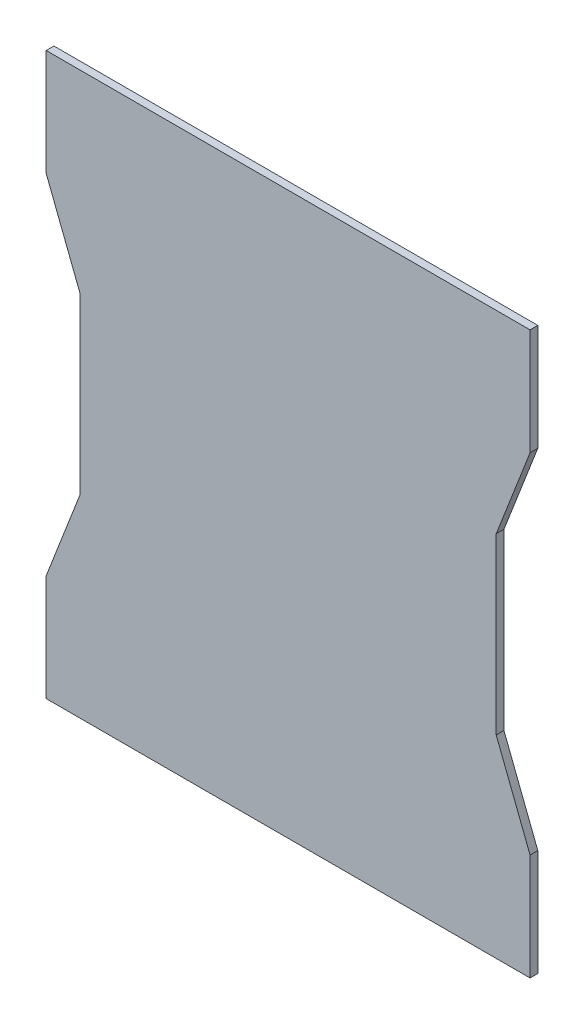
ISO-10303-21;
HEADER;
FILE_DESCRIPTION(('STEP AP214'),'2;1');
FILE_NAME('part.step','',(''),(''),'','','');
FILE_SCHEMA(('AUTOMOTIVE_DESIGN { 1 0 10303 214 1 1 1 1 }'));
ENDSEC;
DATA;
#1=APPLICATION_CONTEXT('core data for automotive mechanical design processes');
#2=APPLICATION_PROTOCOL_DEFINITION('international standard','automotive_design',2000,#1);
#3=PRODUCT_CONTEXT('',#1,'mechanical');
#4=PRODUCT('Part','Part','',(#3));
#5=PRODUCT_RELATED_PRODUCT_CATEGORY('part','',(#4));
#6=PRODUCT_DEFINITION_FORMATION('','',#4);
#7=PRODUCT_DEFINITION_CONTEXT('part definition',#1,'design');
#8=PRODUCT_DEFINITION('design','',#6,#7);
#9=PRODUCT_DEFINITION_SHAPE('','',#8);
#10=(LENGTH_UNIT() NAMED_UNIT(*) SI_UNIT(.MILLI.,.METRE.));
#11=(NAMED_UNIT(*) PLANE_ANGLE_UNIT() SI_UNIT($,.RADIAN.));
#12=(NAMED_UNIT(*) SI_UNIT($,.STERADIAN.) SOLID_ANGLE_UNIT());
#13=UNCERTAINTY_MEASURE_WITH_UNIT(LENGTH_MEASURE(1.E-05),#10,'distance_accuracy_value','');
#14=(GEOMETRIC_REPRESENTATION_CONTEXT(3) GLOBAL_UNCERTAINTY_ASSIGNED_CONTEXT((#13)) GLOBAL_UNIT_ASSIGNED_CONTEXT((#10,
#11,#12)) REPRESENTATION_CONTEXT('',''));
#15=CARTESIAN_POINT('',(0.,0.,0.));
#16=DIRECTION('',(0.,0.,1.));
#17=DIRECTION('',(1.,0.,0.));
#18=AXIS2_PLACEMENT_3D('',#15,#16,#17);
#19=CARTESIAN_POINT('',(-500.,580.,16.));
#20=DIRECTION('',(1.,0.,0.));
#21=DIRECTION('',(0.,1.,0.));
#22=AXIS2_PLACEMENT_3D('',#19,#20,#21);
#23=PLANE('',#22);
#24=DIRECTION('',(0.,-1.,0.));
#25=VECTOR('',#24,1.);
#26=CARTESIAN_POINT('',(-500.,580.,0.));
#27=LINE('',#26,#25);
#28=CARTESIAN_POINT('',(-500.,580.,0.));
#29=VERTEX_POINT('',#28);
#30=CARTESIAN_POINT('',(-500.,360.,0.));
#31=VERTEX_POINT('',#30);
#32=EDGE_CURVE('E192',#29,#31,#27,.T.);
#33=ORIENTED_EDGE('',*,*,#32,.T.);
#34=DIRECTION('',(0.,0.,-1.));
#35=VECTOR('',#34,1.);
#36=CARTESIAN_POINT('',(-500.,360.,16.));
#37=LINE('',#36,#35);
#38=CARTESIAN_POINT('',(-500.,360.,16.));
#39=VERTEX_POINT('',#38);
#40=EDGE_CURVE('E150',#39,#31,#37,.T.);
#41=ORIENTED_EDGE('',*,*,#40,.F.);
#42=DIRECTION('',(0.,-1.,0.));
#43=VECTOR('',#42,1.);
#44=CARTESIAN_POINT('',(-500.,580.,16.));
#45=LINE('',#44,#43);
#46=CARTESIAN_POINT('',(-500.,580.,16.));
#47=VERTEX_POINT('',#46);
#48=EDGE_CURVE('E141',#47,#39,#45,.T.);
#49=ORIENTED_EDGE('',*,*,#48,.F.);
#50=DIRECTION('',(0.,0.,-1.));
#51=VECTOR('',#50,1.);
#52=CARTESIAN_POINT('',(-500.,580.,16.));
#53=LINE('',#52,#51);
#54=EDGE_CURVE('E191',#47,#29,#53,.T.);
#55=ORIENTED_EDGE('',*,*,#54,.T.);
#56=EDGE_LOOP('',(#33,#41,#49,#55));
#57=FACE_BOUND('',#56,.T.);
#58=ADVANCED_FACE('F32',(#57),#23,.F.);
#59=CARTESIAN_POINT('',(500.,580.,16.));
#60=DIRECTION('',(-1.,0.,0.));
#61=DIRECTION('',(0.,-1.,0.));
#62=AXIS2_PLACEMENT_3D('',#59,#60,#61);
#63=PLANE('',#62);
#64=DIRECTION('',(0.,1.,0.));
#65=VECTOR('',#64,1.);
#66=CARTESIAN_POINT('',(500.,580.,16.));
#67=LINE('',#66,#65);
#68=CARTESIAN_POINT('',(500.,360.,16.));
#69=VERTEX_POINT('',#68);
#70=CARTESIAN_POINT('',(500.,580.,16.));
#71=VERTEX_POINT('',#70);
#72=EDGE_CURVE('E185',#69,#71,#67,.T.);
#73=ORIENTED_EDGE('',*,*,#72,.F.);
#74=DIRECTION('',(0.,0.,-1.));
#75=VECTOR('',#74,1.);
#76=CARTESIAN_POINT('',(500.,360.,16.));
#77=LINE('',#76,#75);
#78=CARTESIAN_POINT('',(500.,360.,0.));
#79=VERTEX_POINT('',#78);
#80=EDGE_CURVE('E172',#69,#79,#77,.T.);
#81=ORIENTED_EDGE('',*,*,#80,.T.);
#82=DIRECTION('',(0.,1.,0.));
#83=VECTOR('',#82,1.);
#84=CARTESIAN_POINT('',(500.,580.,0.));
#85=LINE('',#84,#83);
#86=CARTESIAN_POINT('',(500.,580.,0.));
#87=VERTEX_POINT('',#86);
#88=EDGE_CURVE('E197',#79,#87,#85,.T.);
#89=ORIENTED_EDGE('',*,*,#88,.T.);
#90=DIRECTION('',(0.,0.,-1.));
#91=VECTOR('',#90,1.);
#92=CARTESIAN_POINT('',(500.,580.,16.));
#93=LINE('',#92,#91);
#94=EDGE_CURVE('E205',#71,#87,#93,.T.);
#95=ORIENTED_EDGE('',*,*,#94,.F.);
#96=EDGE_LOOP('',(#73,#81,#89,#95));
#97=FACE_BOUND('',#96,.T.);
#98=ADVANCED_FACE('F242',(#97),#63,.F.);
#99=CARTESIAN_POINT('',(-500.,-360.,16.));
#100=VERTEX_POINT('',#99);
#101=CARTESIAN_POINT('',(-500.,-580.,16.));
#102=VERTEX_POINT('',#101);
#103=EDGE_CURVE('E183',#100,#102,#45,.T.);
#104=ORIENTED_EDGE('',*,*,#103,.F.);
#105=DIRECTION('',(0.,0.,-1.));
#106=VECTOR('',#105,1.);
#107=CARTESIAN_POINT('',(-500.,-360.,16.));
#108=LINE('',#107,#106);
#109=CARTESIAN_POINT('',(-500.,-360.,0.));
#110=VERTEX_POINT('',#109);
#111=EDGE_CURVE('E153',#100,#110,#108,.T.);
#112=ORIENTED_EDGE('',*,*,#111,.T.);
#113=CARTESIAN_POINT('',(-500.,-580.,0.));
#114=VERTEX_POINT('',#113);
#115=EDGE_CURVE('E175',#110,#114,#27,.T.);
#116=ORIENTED_EDGE('',*,*,#115,.T.);
#117=DIRECTION('',(0.,0.,-1.));
#118=VECTOR('',#117,1.);
#119=CARTESIAN_POINT('',(-500.,-580.,16.));
#120=LINE('',#119,#118);
#121=EDGE_CURVE('E11',#102,#114,#120,.T.);
#122=ORIENTED_EDGE('',*,*,#121,.F.);
#123=EDGE_LOOP('',(#104,#112,#116,#122));
#124=FACE_BOUND('',#123,.T.);
#125=ADVANCED_FACE('F34',(#124),#23,.F.);
#126=CARTESIAN_POINT('',(-500.,-580.,16.));
#127=DIRECTION('',(0.,1.,0.));
#128=DIRECTION('',(0.,0.,1.));
#129=AXIS2_PLACEMENT_3D('',#126,#127,#128);
#130=PLANE('',#129);
#131=DIRECTION('',(1.,0.,0.));
#132=VECTOR('',#131,1.);
#133=CARTESIAN_POINT('',(-500.,-580.,0.));
#134=LINE('',#133,#132);
#135=CARTESIAN_POINT('',(500.,-580.,0.));
#136=VERTEX_POINT('',#135);
#137=EDGE_CURVE('E195',#114,#136,#134,.T.);
#138=ORIENTED_EDGE('',*,*,#137,.T.);
#139=DIRECTION('',(0.,0.,-1.));
#140=VECTOR('',#139,1.);
#141=CARTESIAN_POINT('',(500.,-580.,16.));
#142=LINE('',#141,#140);
#143=CARTESIAN_POINT('',(500.,-580.,16.));
#144=VERTEX_POINT('',#143);
#145=EDGE_CURVE('E40',#144,#136,#142,.T.);
#146=ORIENTED_EDGE('',*,*,#145,.F.);
#147=DIRECTION('',(1.,0.,0.));
#148=VECTOR('',#147,1.);
#149=CARTESIAN_POINT('',(-500.,-580.,16.));
#150=LINE('',#149,#148);
#151=EDGE_CURVE('E182',#102,#144,#150,.T.);
#152=ORIENTED_EDGE('',*,*,#151,.F.);
#153=ORIENTED_EDGE('',*,*,#121,.T.);
#154=EDGE_LOOP('',(#138,#146,#152,#153));
#155=FACE_BOUND('',#154,.T.);
#156=ADVANCED_FACE('F228',(#155),#130,.F.);
#157=CARTESIAN_POINT('',(500.,-360.,0.));
#158=VERTEX_POINT('',#157);
#159=EDGE_CURVE('E198',#136,#158,#85,.T.);
#160=ORIENTED_EDGE('',*,*,#159,.T.);
#161=DIRECTION('',(0.,0.,-1.));
#162=VECTOR('',#161,1.);
#163=CARTESIAN_POINT('',(500.,-360.,16.));
#164=LINE('',#163,#162);
#165=CARTESIAN_POINT('',(500.,-360.,16.));
#166=VERTEX_POINT('',#165);
#167=EDGE_CURVE('E55',#166,#158,#164,.T.);
#168=ORIENTED_EDGE('',*,*,#167,.F.);
#169=EDGE_CURVE('E186',#144,#166,#67,.T.);
#170=ORIENTED_EDGE('',*,*,#169,.F.);
#171=ORIENTED_EDGE('',*,*,#145,.T.);
#172=EDGE_LOOP('',(#160,#168,#170,#171));
#173=FACE_BOUND('',#172,.T.);
#174=ADVANCED_FACE('F212',(#173),#63,.F.);
#175=CARTESIAN_POINT('',(-500.,580.,16.));
#176=DIRECTION('',(0.,-1.,0.));
#177=DIRECTION('',(0.,0.,-1.));
#178=AXIS2_PLACEMENT_3D('',#175,#176,#177);
#179=PLANE('',#178);
#180=DIRECTION('',(-1.,0.,0.));
#181=VECTOR('',#180,1.);
#182=CARTESIAN_POINT('',(-500.,580.,0.));
#183=LINE('',#182,#181);
#184=EDGE_CURVE('E201',#87,#29,#183,.T.);
#185=ORIENTED_EDGE('',*,*,#184,.T.);
#186=ORIENTED_EDGE('',*,*,#54,.F.);
#187=DIRECTION('',(-1.,0.,0.));
#188=VECTOR('',#187,1.);
#189=CARTESIAN_POINT('',(-500.,580.,16.));
#190=LINE('',#189,#188);
#191=EDGE_CURVE('E189',#71,#47,#190,.T.);
#192=ORIENTED_EDGE('',*,*,#191,.F.);
#193=ORIENTED_EDGE('',*,*,#94,.T.);
#194=EDGE_LOOP('',(#185,#186,#192,#193));
#195=FACE_BOUND('',#194,.T.);
#196=ADVANCED_FACE('F256',(#195),#179,.F.);
#197=CARTESIAN_POINT('',(0.,0.,16.));
#198=DIRECTION('',(0.,0.,1.));
#199=DIRECTION('',(1.,0.,0.));
#200=AXIS2_PLACEMENT_3D('',#197,#198,#199);
#201=PLANE('',#200);
#202=DIRECTION('',(0.362446261154949,-0.932004671541296,0.));
#203=VECTOR('',#202,1.);
#204=CARTESIAN_POINT('',(-500.,360.,16.));
#205=LINE('',#204,#203);
#206=CARTESIAN_POINT('',(-430.,180.,16.));
#207=VERTEX_POINT('',#206);
#208=EDGE_CURVE('E123',#39,#207,#205,.T.);
#209=ORIENTED_EDGE('',*,*,#208,.T.);
#210=DIRECTION('',(0.,-1.,0.));
#211=VECTOR('',#210,1.);
#212=CARTESIAN_POINT('',(-430.,180.,16.));
#213=LINE('',#212,#211);
#214=CARTESIAN_POINT('',(-430.,-180.,16.));
#215=VERTEX_POINT('',#214);
#216=EDGE_CURVE('E132',#207,#215,#213,.T.);
#217=ORIENTED_EDGE('',*,*,#216,.T.);
#218=DIRECTION('',(-0.362446261154949,-0.932004671541296,0.));
#219=VECTOR('',#218,1.);
#220=CARTESIAN_POINT('',(-430.,-180.,16.));
#221=LINE('',#220,#219);
#222=EDGE_CURVE('E129',#215,#100,#221,.T.);
#223=ORIENTED_EDGE('',*,*,#222,.T.);
#224=ORIENTED_EDGE('',*,*,#103,.T.);
#225=ORIENTED_EDGE('',*,*,#151,.T.);
#226=ORIENTED_EDGE('',*,*,#169,.T.);
#227=DIRECTION('',(-0.362446261154948,0.932004671541296,0.));
#228=VECTOR('',#227,1.);
#229=CARTESIAN_POINT('',(430.,-180.,16.));
#230=LINE('',#229,#228);
#231=CARTESIAN_POINT('',(430.,-180.,16.));
#232=VERTEX_POINT('',#231);
#233=EDGE_CURVE('E157',#166,#232,#230,.T.);
#234=ORIENTED_EDGE('',*,*,#233,.T.);
#235=DIRECTION('',(0.,1.,0.));
#236=VECTOR('',#235,1.);
#237=CARTESIAN_POINT('',(430.,180.,16.));
#238=LINE('',#237,#236);
#239=CARTESIAN_POINT('',(430.,180.,16.));
#240=VERTEX_POINT('',#239);
#241=EDGE_CURVE('E160',#232,#240,#238,.T.);
#242=ORIENTED_EDGE('',*,*,#241,.T.);
#243=DIRECTION('',(0.362446261154948,0.932004671541296,0.));
#244=VECTOR('',#243,1.);
#245=CARTESIAN_POINT('',(500.,360.,16.));
#246=LINE('',#245,#244);
#247=EDGE_CURVE('E164',#240,#69,#246,.T.);
#248=ORIENTED_EDGE('',*,*,#247,.T.);
#249=ORIENTED_EDGE('',*,*,#72,.T.);
#250=ORIENTED_EDGE('',*,*,#191,.T.);
#251=ORIENTED_EDGE('',*,*,#48,.T.);
#252=EDGE_LOOP('',(#209,#217,#223,#224,#225,#226,#234,#242,#248,#249,#250,#251));
#253=FACE_BOUND('',#252,.T.);
#254=ADVANCED_FACE('F139',(#253),#201,.T.);
#255=CARTESIAN_POINT('',(0.,0.,0.));
#256=DIRECTION('',(0.,0.,1.));
#257=DIRECTION('',(1.,0.,0.));
#258=AXIS2_PLACEMENT_3D('',#255,#256,#257);
#259=PLANE('',#258);
#260=DIRECTION('',(0.,-1.,0.));
#261=VECTOR('',#260,1.);
#262=CARTESIAN_POINT('',(-430.,180.,0.));
#263=LINE('',#262,#261);
#264=CARTESIAN_POINT('',(-430.,180.,0.));
#265=VERTEX_POINT('',#264);
#266=CARTESIAN_POINT('',(-430.,-180.,0.));
#267=VERTEX_POINT('',#266);
#268=EDGE_CURVE('E144',#265,#267,#263,.T.);
#269=ORIENTED_EDGE('',*,*,#268,.F.);
#270=DIRECTION('',(0.362446261154949,-0.932004671541296,0.));
#271=VECTOR('',#270,1.);
#272=CARTESIAN_POINT('',(-500.,360.,0.));
#273=LINE('',#272,#271);
#274=EDGE_CURVE('E47',#31,#265,#273,.T.);
#275=ORIENTED_EDGE('',*,*,#274,.F.);
#276=ORIENTED_EDGE('',*,*,#32,.F.);
#277=ORIENTED_EDGE('',*,*,#184,.F.);
#278=ORIENTED_EDGE('',*,*,#88,.F.);
#279=DIRECTION('',(0.362446261154948,0.932004671541296,0.));
#280=VECTOR('',#279,1.);
#281=CARTESIAN_POINT('',(500.,360.,0.));
#282=LINE('',#281,#280);
#283=CARTESIAN_POINT('',(430.,180.,0.));
#284=VERTEX_POINT('',#283);
#285=EDGE_CURVE('E161',#284,#79,#282,.T.);
#286=ORIENTED_EDGE('',*,*,#285,.F.);
#287=DIRECTION('',(0.,1.,0.));
#288=VECTOR('',#287,1.);
#289=CARTESIAN_POINT('',(430.,180.,0.));
#290=LINE('',#289,#288);
#291=CARTESIAN_POINT('',(430.,-180.,0.));
#292=VERTEX_POINT('',#291);
#293=EDGE_CURVE('E168',#292,#284,#290,.T.);
#294=ORIENTED_EDGE('',*,*,#293,.F.);
#295=DIRECTION('',(-0.362446261154948,0.932004671541296,0.));
#296=VECTOR('',#295,1.);
#297=CARTESIAN_POINT('',(430.,-180.,0.));
#298=LINE('',#297,#296);
#299=EDGE_CURVE('E152',#158,#292,#298,.T.);
#300=ORIENTED_EDGE('',*,*,#299,.F.);
#301=ORIENTED_EDGE('',*,*,#159,.F.);
#302=ORIENTED_EDGE('',*,*,#137,.F.);
#303=ORIENTED_EDGE('',*,*,#115,.F.);
#304=DIRECTION('',(-0.362446261154949,-0.932004671541296,0.));
#305=VECTOR('',#304,1.);
#306=CARTESIAN_POINT('',(-430.,-180.,0.));
#307=LINE('',#306,#305);
#308=EDGE_CURVE('E142',#267,#110,#307,.T.);
#309=ORIENTED_EDGE('',*,*,#308,.F.);
#310=EDGE_LOOP('',(#269,#275,#276,#277,#278,#286,#294,#300,#301,#302,#303,#309));
#311=FACE_BOUND('',#310,.T.);
#312=ADVANCED_FACE('F217',(#311),#259,.F.);
#313=CARTESIAN_POINT('',(500.,360.,16.));
#314=DIRECTION('',(-0.932004671541296,0.362446261154949,0.));
#315=DIRECTION('',(-0.362446261154948,-0.932004671541296,0.));
#316=AXIS2_PLACEMENT_3D('',#313,#314,#315);
#317=PLANE('',#316);
#318=ORIENTED_EDGE('',*,*,#285,.T.);
#319=ORIENTED_EDGE('',*,*,#80,.F.);
#320=ORIENTED_EDGE('',*,*,#247,.F.);
#321=DIRECTION('',(0.,0.,-1.));
#322=VECTOR('',#321,1.);
#323=CARTESIAN_POINT('',(430.,180.,16.));
#324=LINE('',#323,#322);
#325=EDGE_CURVE('E176',#240,#284,#324,.T.);
#326=ORIENTED_EDGE('',*,*,#325,.T.);
#327=EDGE_LOOP('',(#318,#319,#320,#326));
#328=FACE_BOUND('',#327,.T.);
#329=ADVANCED_FACE('F263',(#328),#317,.F.);
#330=CARTESIAN_POINT('',(430.,180.,16.));
#331=DIRECTION('',(-1.,0.,0.));
#332=DIRECTION('',(0.,0.,1.));
#333=AXIS2_PLACEMENT_3D('',#330,#331,#332);
#334=PLANE('',#333);
#335=ORIENTED_EDGE('',*,*,#293,.T.);
#336=ORIENTED_EDGE('',*,*,#325,.F.);
#337=ORIENTED_EDGE('',*,*,#241,.F.);
#338=DIRECTION('',(0.,0.,-1.));
#339=VECTOR('',#338,1.);
#340=CARTESIAN_POINT('',(430.,-180.,16.));
#341=LINE('',#340,#339);
#342=EDGE_CURVE('E178',#232,#292,#341,.T.);
#343=ORIENTED_EDGE('',*,*,#342,.T.);
#344=EDGE_LOOP('',(#335,#336,#337,#343));
#345=FACE_BOUND('',#344,.T.);
#346=ADVANCED_FACE('F224',(#345),#334,.F.);
#347=CARTESIAN_POINT('',(430.,-180.,16.));
#348=DIRECTION('',(-0.932004671541296,-0.362446261154949,0.));
#349=DIRECTION('',(0.362446261154948,-0.932004671541296,0.));
#350=AXIS2_PLACEMENT_3D('',#347,#348,#349);
#351=PLANE('',#350);
#352=ORIENTED_EDGE('',*,*,#299,.T.);
#353=ORIENTED_EDGE('',*,*,#342,.F.);
#354=ORIENTED_EDGE('',*,*,#233,.F.);
#355=ORIENTED_EDGE('',*,*,#167,.T.);
#356=EDGE_LOOP('',(#352,#353,#354,#355));
#357=FACE_BOUND('',#356,.T.);
#358=ADVANCED_FACE('F221',(#357),#351,.F.);
#359=CARTESIAN_POINT('',(-500.,360.,16.));
#360=DIRECTION('',(0.932004671541296,0.362446261154949,0.));
#361=DIRECTION('',(-0.362446261154949,0.932004671541296,0.));
#362=AXIS2_PLACEMENT_3D('',#359,#360,#361);
#363=PLANE('',#362);
#364=ORIENTED_EDGE('',*,*,#274,.T.);
#365=DIRECTION('',(0.,0.,-1.));
#366=VECTOR('',#365,1.);
#367=CARTESIAN_POINT('',(-430.,180.,16.));
#368=LINE('',#367,#366);
#369=EDGE_CURVE('E119',#207,#265,#368,.T.);
#370=ORIENTED_EDGE('',*,*,#369,.F.);
#371=ORIENTED_EDGE('',*,*,#208,.F.);
#372=ORIENTED_EDGE('',*,*,#40,.T.);
#373=EDGE_LOOP('',(#364,#370,#371,#372));
#374=FACE_BOUND('',#373,.T.);
#375=ADVANCED_FACE('F121',(#374),#363,.F.);
#376=CARTESIAN_POINT('',(-430.,-180.,16.));
#377=DIRECTION('',(0.932004671541296,-0.362446261154949,0.));
#378=DIRECTION('',(0.362446261154949,0.932004671541296,0.));
#379=AXIS2_PLACEMENT_3D('',#376,#377,#378);
#380=PLANE('',#379);
#381=ORIENTED_EDGE('',*,*,#308,.T.);
#382=ORIENTED_EDGE('',*,*,#111,.F.);
#383=ORIENTED_EDGE('',*,*,#222,.F.);
#384=DIRECTION('',(0.,0.,-1.));
#385=VECTOR('',#384,1.);
#386=CARTESIAN_POINT('',(-430.,-180.,16.));
#387=LINE('',#386,#385);
#388=EDGE_CURVE('E128',#215,#267,#387,.T.);
#389=ORIENTED_EDGE('',*,*,#388,.T.);
#390=EDGE_LOOP('',(#381,#382,#383,#389));
#391=FACE_BOUND('',#390,.T.);
#392=ADVANCED_FACE('F232',(#391),#380,.F.);
#393=CARTESIAN_POINT('',(-430.,180.,16.));
#394=DIRECTION('',(1.,0.,0.));
#395=DIRECTION('',(0.,1.,0.));
#396=AXIS2_PLACEMENT_3D('',#393,#394,#395);
#397=PLANE('',#396);
#398=ORIENTED_EDGE('',*,*,#268,.T.);
#399=ORIENTED_EDGE('',*,*,#388,.F.);
#400=ORIENTED_EDGE('',*,*,#216,.F.);
#401=ORIENTED_EDGE('',*,*,#369,.T.);
#402=EDGE_LOOP('',(#398,#399,#400,#401));
#403=FACE_BOUND('',#402,.T.);
#404=ADVANCED_FACE('F133',(#403),#397,.F.);
#405=CLOSED_SHELL('',(#58,#98,#125,#156,#174,#196,#254,#312,#329,#346,#358,#375,#392,#404));
#406=MANIFOLD_SOLID_BREP('B2',#405);
#407=ADVANCED_BREP_SHAPE_REPRESENTATION('',(#18,#406),#14);
#408=SHAPE_DEFINITION_REPRESENTATION(#9,#407);
ENDSEC;
END-ISO-10303-21;
